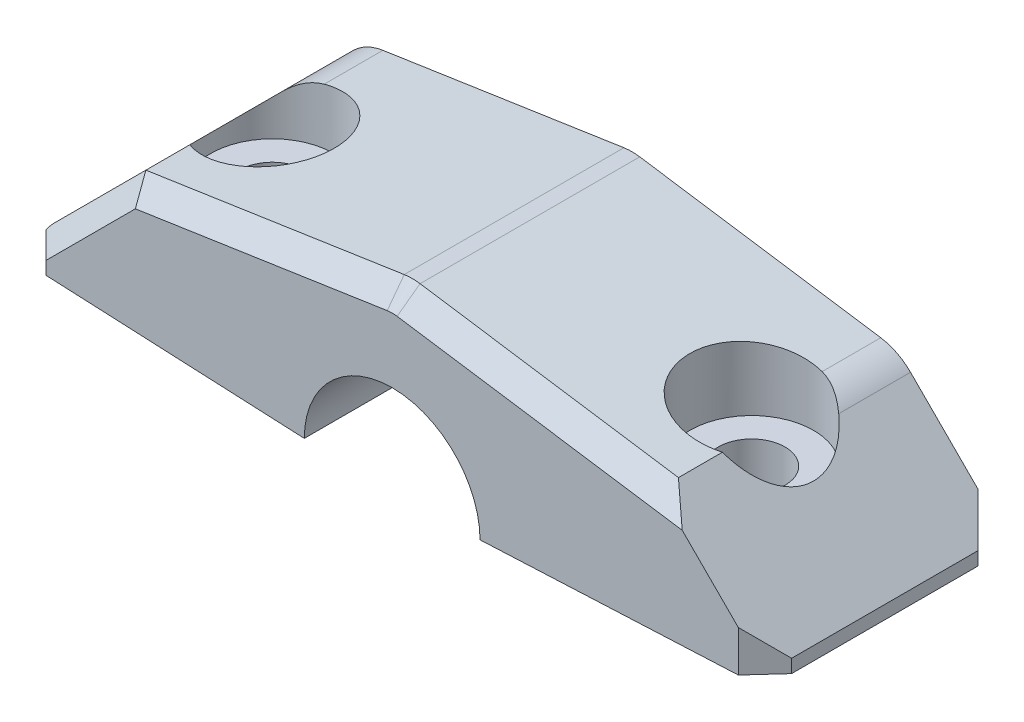
ISO-10303-21;
HEADER;
FILE_DESCRIPTION(('STEP AP214'),'2;1');
FILE_NAME('part.step','',(''),(''),'','','');
FILE_SCHEMA(('AUTOMOTIVE_DESIGN { 1 0 10303 214 1 1 1 1 }'));
ENDSEC;
DATA;
#1=APPLICATION_CONTEXT('core data for automotive mechanical design processes');
#2=APPLICATION_PROTOCOL_DEFINITION('international standard','automotive_design',2000,#1);
#3=PRODUCT_CONTEXT('',#1,'mechanical');
#4=PRODUCT('Part','Part','',(#3));
#5=PRODUCT_RELATED_PRODUCT_CATEGORY('part','',(#4));
#6=PRODUCT_DEFINITION_FORMATION('','',#4);
#7=PRODUCT_DEFINITION_CONTEXT('part definition',#1,'design');
#8=PRODUCT_DEFINITION('design','',#6,#7);
#9=PRODUCT_DEFINITION_SHAPE('','',#8);
#10=(LENGTH_UNIT() NAMED_UNIT(*) SI_UNIT(.MILLI.,.METRE.));
#11=(NAMED_UNIT(*) PLANE_ANGLE_UNIT() SI_UNIT($,.RADIAN.));
#12=(NAMED_UNIT(*) SI_UNIT($,.STERADIAN.) SOLID_ANGLE_UNIT());
#13=UNCERTAINTY_MEASURE_WITH_UNIT(LENGTH_MEASURE(1.E-05),#10,'distance_accuracy_value','');
#14=(GEOMETRIC_REPRESENTATION_CONTEXT(3) GLOBAL_UNCERTAINTY_ASSIGNED_CONTEXT((#13)) GLOBAL_UNIT_ASSIGNED_CONTEXT((#10,
#11,#12)) REPRESENTATION_CONTEXT('',''));
#15=CARTESIAN_POINT('',(0.,0.,0.));
#16=DIRECTION('',(0.,0.,1.));
#17=DIRECTION('',(1.,0.,0.));
#18=AXIS2_PLACEMENT_3D('',#15,#16,#17);
#19=CARTESIAN_POINT('',(9.,6.50025,4.5));
#20=DIRECTION('',(0.,-1.,0.));
#21=DIRECTION('',(0.,0.,-1.));
#22=AXIS2_PLACEMENT_3D('',#19,#20,#21);
#23=CYLINDRICAL_SURFACE('',#22,1.25);
#24=CARTESIAN_POINT('',(9.,0.26635514018692,4.5));
#25=DIRECTION('',(-0.0466780367466305,0.998909986377892,0.));
#26=DIRECTION('',(-0.998909986377892,-0.0466780367466305,0.));
#27=AXIS2_PLACEMENT_3D('',#24,#25,#26);
#28=ELLIPSE('',#27,1.25136400381037,1.25);
#29=CARTESIAN_POINT('',(7.75,0.207943925233648,4.5));
#30=VERTEX_POINT('',#29);
#31=EDGE_CURVE('E509',#30,#30,#28,.F.);
#32=ORIENTED_EDGE('',*,*,#31,.T.);
#33=EDGE_LOOP('',(#32));
#34=FACE_BOUND('',#33,.T.);
#35=CARTESIAN_POINT('',(9.,3.,4.5));
#36=DIRECTION('',(0.,1.,0.));
#37=DIRECTION('',(0.,0.,1.));
#38=AXIS2_PLACEMENT_3D('',#35,#36,#37);
#39=CIRCLE('',#38,1.25);
#40=CARTESIAN_POINT('',(9.,3.,5.75));
#41=VERTEX_POINT('',#40);
#42=EDGE_CURVE('E248',#41,#41,#39,.T.);
#43=ORIENTED_EDGE('',*,*,#42,.T.);
#44=EDGE_LOOP('',(#43));
#45=FACE_BOUND('',#44,.T.);
#46=ADVANCED_FACE('F86',(#34,#45),#23,.F.);
#47=CARTESIAN_POINT('',(-9.,6.50025,4.5));
#48=DIRECTION('',(0.,-1.,0.));
#49=DIRECTION('',(0.,0.,-1.));
#50=AXIS2_PLACEMENT_3D('',#47,#48,#49);
#51=CYLINDRICAL_SURFACE('',#50,1.25);
#52=CARTESIAN_POINT('',(-9.,0.266355140186916,4.5));
#53=DIRECTION('',(0.0466780367466305,0.998909986377892,0.));
#54=DIRECTION('',(0.998909986377892,-0.0466780367466305,0.));
#55=AXIS2_PLACEMENT_3D('',#52,#53,#54);
#56=ELLIPSE('',#55,1.25136400381037,1.25);
#57=CARTESIAN_POINT('',(-7.75,0.207943925233645,4.5));
#58=VERTEX_POINT('',#57);
#59=EDGE_CURVE('E512',#58,#58,#56,.F.);
#60=ORIENTED_EDGE('',*,*,#59,.T.);
#61=EDGE_LOOP('',(#60));
#62=FACE_BOUND('',#61,.T.);
#63=CARTESIAN_POINT('',(-9.,3.,4.5));
#64=DIRECTION('',(0.,1.,0.));
#65=DIRECTION('',(0.,0.,1.));
#66=AXIS2_PLACEMENT_3D('',#63,#64,#65);
#67=CIRCLE('',#66,1.25);
#68=CARTESIAN_POINT('',(-9.,3.,5.75));
#69=VERTEX_POINT('',#68);
#70=EDGE_CURVE('E328',#69,#69,#67,.T.);
#71=ORIENTED_EDGE('',*,*,#70,.T.);
#72=EDGE_LOOP('',(#71));
#73=FACE_BOUND('',#72,.T.);
#74=ADVANCED_FACE('F394',(#62,#73),#51,.F.);
#75=CARTESIAN_POINT('',(0.,0.,9.));
#76=DIRECTION('',(0.,0.,1.));
#77=DIRECTION('',(1.,0.,0.));
#78=AXIS2_PLACEMENT_3D('',#75,#76,#77);
#79=PLANE('',#78);
#80=DIRECTION('',(-0.988936352868298,-0.148340452930245,0.));
#81=VECTOR('',#80,1.);
#82=CARTESIAN_POINT('',(-0.842289892576154,5.61526595050769,9.));
#83=LINE('',#82,#81);
#84=CARTESIAN_POINT('',(-0.185425566162809,5.71379559946969,9.));
#85=VERTEX_POINT('',#84);
#86=CARTESIAN_POINT('',(-9.64438869861889,4.29495112960128,9.));
#87=VERTEX_POINT('',#86);
#88=EDGE_CURVE('E472',#85,#87,#83,.T.);
#89=ORIENTED_EDGE('',*,*,#88,.T.);
#90=DIRECTION('',(-0.707106781186548,-0.707106781186547,0.));
#91=VECTOR('',#90,1.);
#92=CARTESIAN_POINT('',(-6.96966991411008,6.96966991411009,9.));
#93=LINE('',#92,#91);
#94=CARTESIAN_POINT('',(-13.,0.939339828220177,9.));
#95=VERTEX_POINT('',#94);
#96=EDGE_CURVE('E470',#87,#95,#93,.T.);
#97=ORIENTED_EDGE('',*,*,#96,.T.);
#98=DIRECTION('',(0.,-1.,0.));
#99=VECTOR('',#98,1.);
#100=CARTESIAN_POINT('',(-13.,0.500000000000001,9.));
#101=LINE('',#100,#99);
#102=CARTESIAN_POINT('',(-13.,0.453271028037383,9.));
#103=VERTEX_POINT('',#102);
#104=EDGE_CURVE('E324',#95,#103,#101,.T.);
#105=ORIENTED_EDGE('',*,*,#104,.T.);
#106=DIRECTION('',(0.998909986377892,-0.0466780367466305,0.));
#107=VECTOR('',#106,1.);
#108=CARTESIAN_POINT('',(-3.3,0.,9.));
#109=LINE('',#108,#107);
#110=CARTESIAN_POINT('',(-3.3,0.,9.));
#111=VERTEX_POINT('',#110);
#112=EDGE_CURVE('E277',#103,#111,#109,.T.);
#113=ORIENTED_EDGE('',*,*,#112,.T.);
#114=CARTESIAN_POINT('',(0.,0.,9.));
#115=DIRECTION('',(0.,0.,-1.));
#116=DIRECTION('',(1.,0.,0.));
#117=AXIS2_PLACEMENT_3D('',#114,#115,#116);
#118=CIRCLE('',#117,3.3);
#119=CARTESIAN_POINT('',(3.3,0.,9.));
#120=VERTEX_POINT('',#119);
#121=EDGE_CURVE('E270',#111,#120,#118,.T.);
#122=ORIENTED_EDGE('',*,*,#121,.T.);
#123=DIRECTION('',(0.998909986377892,0.0466780367466305,0.));
#124=VECTOR('',#123,1.);
#125=CARTESIAN_POINT('',(3.3,0.,9.));
#126=LINE('',#125,#124);
#127=CARTESIAN_POINT('',(13.,0.453271028037387,9.));
#128=VERTEX_POINT('',#127);
#129=EDGE_CURVE('E273',#120,#128,#126,.T.);
#130=ORIENTED_EDGE('',*,*,#129,.T.);
#131=DIRECTION('',(0.,1.,0.));
#132=VECTOR('',#131,1.);
#133=CARTESIAN_POINT('',(13.,1.,9.));
#134=LINE('',#133,#132);
#135=CARTESIAN_POINT('',(13.,2.00000000000001,9.));
#136=VERTEX_POINT('',#135);
#137=EDGE_CURVE('E237',#128,#136,#134,.T.);
#138=ORIENTED_EDGE('',*,*,#137,.T.);
#139=DIRECTION('',(0.707106781186548,-0.707106781186547,0.));
#140=VECTOR('',#139,1.);
#141=CARTESIAN_POINT('',(7.49999999999999,7.5,9.));
#142=LINE('',#141,#140);
#143=CARTESIAN_POINT('',(10.8922241948305,4.10777580516955,9.));
#144=VERTEX_POINT('',#143);
#145=EDGE_CURVE('E255',#144,#136,#142,.T.);
#146=ORIENTED_EDGE('',*,*,#145,.F.);
#147=DIRECTION('',(-0.988936352868298,0.148340452930244,0.));
#148=VECTOR('',#147,1.);
#149=CARTESIAN_POINT('',(0.1854255661628,5.71379559946969,9.));
#150=LINE('',#149,#148);
#151=CARTESIAN_POINT('',(0.1854255661628,5.71379559946969,9.));
#152=VERTEX_POINT('',#151);
#153=EDGE_CURVE('E381',#144,#152,#150,.T.);
#154=ORIENTED_EDGE('',*,*,#153,.T.);
#155=CARTESIAN_POINT('',(0.,4.47762515838433,9.));
#156=DIRECTION('',(0.,0.,1.));
#157=DIRECTION('',(1.,0.,0.));
#158=AXIS2_PLACEMENT_3D('',#155,#156,#157);
#159=CIRCLE('',#158,1.24999999999999);
#160=EDGE_CURVE('E479',#152,#85,#159,.T.);
#161=ORIENTED_EDGE('',*,*,#160,.T.);
#162=EDGE_LOOP('',(#89,#97,#105,#113,#122,#130,#138,#146,#154,#161));
#163=FACE_BOUND('',#162,.T.);
#164=ADVANCED_FACE('F398',(#163),#79,.T.);
#165=CARTESIAN_POINT('',(0.,0.,0.));
#166=DIRECTION('',(0.,0.,1.));
#167=DIRECTION('',(1.,0.,0.));
#168=AXIS2_PLACEMENT_3D('',#165,#166,#167);
#169=PLANE('',#168);
#170=DIRECTION('',(0.988936352868298,-0.148340452930244,0.));
#171=VECTOR('',#170,1.);
#172=CARTESIAN_POINT('',(0.953545232273837,6.35696821515892,0.));
#173=LINE('',#172,#171);
#174=CARTESIAN_POINT('',(0.296680905860484,6.45549786412093,0.));
#175=VERTEX_POINT('',#174);
#176=CARTESIAN_POINT('',(9.34838410217753,5.09774238467337,0.));
#177=VERTEX_POINT('',#176);
#178=EDGE_CURVE('E257',#175,#177,#173,.T.);
#179=ORIENTED_EDGE('',*,*,#178,.T.);
#180=CARTESIAN_POINT('',(9.05170319631704,3.11986967893678,0.));
#181=DIRECTION('',(0.,0.,1.));
#182=DIRECTION('',(1.,0.,0.));
#183=AXIS2_PLACEMENT_3D('',#180,#181,#182);
#184=CIRCLE('',#183,2.);
#185=CARTESIAN_POINT('',(10.4659167586901,4.53408324130987,0.));
#186=VERTEX_POINT('',#185);
#187=EDGE_CURVE('E518',#177,#186,#184,.F.);
#188=ORIENTED_EDGE('',*,*,#187,.T.);
#189=DIRECTION('',(0.707106781186548,-0.707106781186547,0.));
#190=VECTOR('',#189,1.);
#191=CARTESIAN_POINT('',(7.49999999999999,7.5,0.));
#192=LINE('',#191,#190);
#193=CARTESIAN_POINT('',(13.,2.00000000000001,0.));
#194=VERTEX_POINT('',#193);
#195=EDGE_CURVE('E252',#186,#194,#192,.T.);
#196=ORIENTED_EDGE('',*,*,#195,.T.);
#197=DIRECTION('',(0.,-1.,0.));
#198=VECTOR('',#197,1.);
#199=CARTESIAN_POINT('',(13.,0.,0.));
#200=LINE('',#199,#198);
#201=CARTESIAN_POINT('',(13.,0.453271028037387,0.));
#202=VERTEX_POINT('',#201);
#203=EDGE_CURVE('E302',#194,#202,#200,.T.);
#204=ORIENTED_EDGE('',*,*,#203,.T.);
#205=DIRECTION('',(0.998909986377892,0.0466780367466305,0.));
#206=VECTOR('',#205,1.);
#207=CARTESIAN_POINT('',(3.3,0.,0.));
#208=LINE('',#207,#206);
#209=CARTESIAN_POINT('',(3.3,0.,0.));
#210=VERTEX_POINT('',#209);
#211=EDGE_CURVE('E282',#210,#202,#208,.T.);
#212=ORIENTED_EDGE('',*,*,#211,.F.);
#213=CARTESIAN_POINT('',(0.,0.,0.));
#214=DIRECTION('',(0.,0.,-1.));
#215=DIRECTION('',(1.,0.,0.));
#216=AXIS2_PLACEMENT_3D('',#213,#214,#215);
#217=CIRCLE('',#216,3.3);
#218=CARTESIAN_POINT('',(-3.3,0.,0.));
#219=VERTEX_POINT('',#218);
#220=EDGE_CURVE('E269',#219,#210,#217,.T.);
#221=ORIENTED_EDGE('',*,*,#220,.F.);
#222=DIRECTION('',(0.998909986377892,-0.0466780367466305,0.));
#223=VECTOR('',#222,1.);
#224=CARTESIAN_POINT('',(-3.3,0.,0.));
#225=LINE('',#224,#223);
#226=CARTESIAN_POINT('',(-13.,0.453271028037383,0.));
#227=VERTEX_POINT('',#226);
#228=EDGE_CURVE('E274',#227,#219,#225,.T.);
#229=ORIENTED_EDGE('',*,*,#228,.F.);
#230=DIRECTION('',(0.,1.,0.));
#231=VECTOR('',#230,1.);
#232=CARTESIAN_POINT('',(-13.,0.,0.));
#233=LINE('',#232,#231);
#234=CARTESIAN_POINT('',(-13.,2.,0.));
#235=VERTEX_POINT('',#234);
#236=EDGE_CURVE('E304',#227,#235,#233,.T.);
#237=ORIENTED_EDGE('',*,*,#236,.T.);
#238=DIRECTION('',(-0.707106781186548,-0.707106781186547,0.));
#239=VECTOR('',#238,1.);
#240=CARTESIAN_POINT('',(-7.5,7.5,0.));
#241=LINE('',#240,#239);
#242=CARTESIAN_POINT('',(-10.4659167586901,4.53408324130987,0.));
#243=VERTEX_POINT('',#242);
#244=EDGE_CURVE('E261',#243,#235,#241,.T.);
#245=ORIENTED_EDGE('',*,*,#244,.F.);
#246=CARTESIAN_POINT('',(-9.05170319631704,3.11986967893678,0.));
#247=DIRECTION('',(0.,0.,1.));
#248=DIRECTION('',(1.,0.,0.));
#249=AXIS2_PLACEMENT_3D('',#246,#247,#248);
#250=CIRCLE('',#249,2.);
#251=CARTESIAN_POINT('',(-9.34838410217752,5.09774238467337,0.));
#252=VERTEX_POINT('',#251);
#253=EDGE_CURVE('E524',#243,#252,#250,.F.);
#254=ORIENTED_EDGE('',*,*,#253,.T.);
#255=DIRECTION('',(-0.988936352868298,-0.148340452930245,0.));
#256=VECTOR('',#255,1.);
#257=CARTESIAN_POINT('',(-0.953545232273839,6.35696821515892,0.));
#258=LINE('',#257,#256);
#259=CARTESIAN_POINT('',(-0.296680905860494,6.45549786412093,0.));
#260=VERTEX_POINT('',#259);
#261=EDGE_CURVE('E263',#260,#252,#258,.T.);
#262=ORIENTED_EDGE('',*,*,#261,.F.);
#263=CARTESIAN_POINT('',(0.,4.47762515838433,0.));
#264=DIRECTION('',(0.,0.,1.));
#265=DIRECTION('',(1.,0.,0.));
#266=AXIS2_PLACEMENT_3D('',#263,#264,#265);
#267=CIRCLE('',#266,2.);
#268=EDGE_CURVE('E521',#260,#175,#267,.F.);
#269=ORIENTED_EDGE('',*,*,#268,.T.);
#270=EDGE_LOOP('',(#179,#188,#196,#204,#212,#221,#229,#237,#245,#254,#262,#269));
#271=FACE_BOUND('',#270,.T.);
#272=ADVANCED_FACE('F416',(#271),#169,.F.);
#273=CARTESIAN_POINT('',(0.,0.,9.));
#274=DIRECTION('',(0.,0.,-1.));
#275=DIRECTION('',(-1.,0.,0.));
#276=AXIS2_PLACEMENT_3D('',#273,#274,#275);
#277=CYLINDRICAL_SURFACE('',#276,3.3);
#278=ORIENTED_EDGE('',*,*,#220,.T.);
#279=DIRECTION('',(0.,0.,-1.));
#280=VECTOR('',#279,1.);
#281=CARTESIAN_POINT('',(3.3,0.,9.));
#282=LINE('',#281,#280);
#283=EDGE_CURVE('E294',#120,#210,#282,.T.);
#284=ORIENTED_EDGE('',*,*,#283,.F.);
#285=ORIENTED_EDGE('',*,*,#121,.F.);
#286=DIRECTION('',(0.,0.,-1.));
#287=VECTOR('',#286,1.);
#288=CARTESIAN_POINT('',(-3.3,0.,9.));
#289=LINE('',#288,#287);
#290=EDGE_CURVE('E279',#111,#219,#289,.T.);
#291=ORIENTED_EDGE('',*,*,#290,.T.);
#292=EDGE_LOOP('',(#278,#284,#285,#291));
#293=FACE_BOUND('',#292,.T.);
#294=ADVANCED_FACE('F420',(#293),#277,.F.);
#295=CARTESIAN_POINT('',(3.3,0.,9.));
#296=DIRECTION('',(-0.0466780367466305,0.998909986377892,0.));
#297=DIRECTION('',(-0.998909986377892,-0.0466780367466305,0.));
#298=AXIS2_PLACEMENT_3D('',#295,#296,#297);
#299=PLANE('',#298);
#300=ORIENTED_EDGE('',*,*,#31,.F.);
#301=EDGE_LOOP('',(#300));
#302=FACE_BOUND('',#301,.T.);
#303=ORIENTED_EDGE('',*,*,#211,.T.);
#304=DIRECTION('',(-0.706721087952453,-0.0330243499043203,-0.706721087952453));
#305=VECTOR('',#304,1.);
#306=CARTESIAN_POINT('',(14.,0.500000000000004,1.));
#307=LINE('',#306,#305);
#308=CARTESIAN_POINT('',(14.,0.500000000000004,1.));
#309=VERTEX_POINT('',#308);
#310=EDGE_CURVE('E322',#202,#309,#307,.F.);
#311=ORIENTED_EDGE('',*,*,#310,.T.);
#312=DIRECTION('',(0.,0.,-1.));
#313=VECTOR('',#312,1.);
#314=CARTESIAN_POINT('',(14.,0.500000000000004,9.));
#315=LINE('',#314,#313);
#316=CARTESIAN_POINT('',(14.,0.500000000000004,7.99999999999999));
#317=VERTEX_POINT('',#316);
#318=EDGE_CURVE('E291',#317,#309,#315,.T.);
#319=ORIENTED_EDGE('',*,*,#318,.F.);
#320=DIRECTION('',(-0.706721087952451,-0.0330243499043202,0.706721087952454));
#321=VECTOR('',#320,1.);
#322=CARTESIAN_POINT('',(12.98942110544,0.452776687170095,9.01057889456005));
#323=LINE('',#322,#321);
#324=EDGE_CURVE('E320',#317,#128,#323,.T.);
#325=ORIENTED_EDGE('',*,*,#324,.T.);
#326=ORIENTED_EDGE('',*,*,#129,.F.);
#327=ORIENTED_EDGE('',*,*,#283,.T.);
#328=EDGE_LOOP('',(#303,#311,#319,#325,#326,#327));
#329=FACE_BOUND('',#328,.T.);
#330=ADVANCED_FACE('F428',(#302,#329),#299,.F.);
#331=CARTESIAN_POINT('',(14.,0.500000000000004,9.));
#332=DIRECTION('',(-1.,0.,0.));
#333=DIRECTION('',(0.,-1.,0.));
#334=AXIS2_PLACEMENT_3D('',#331,#332,#333);
#335=PLANE('',#334);
#336=ORIENTED_EDGE('',*,*,#318,.T.);
#337=DIRECTION('',(0.,1.,0.));
#338=VECTOR('',#337,1.);
#339=CARTESIAN_POINT('',(14.,0.500000000000004,1.));
#340=LINE('',#339,#338);
#341=CARTESIAN_POINT('',(14.,1.,1.));
#342=VERTEX_POINT('',#341);
#343=EDGE_CURVE('E312',#309,#342,#340,.T.);
#344=ORIENTED_EDGE('',*,*,#343,.T.);
#345=DIRECTION('',(0.,0.,1.));
#346=VECTOR('',#345,1.);
#347=CARTESIAN_POINT('',(14.,1.,0.));
#348=LINE('',#347,#346);
#349=CARTESIAN_POINT('',(14.,1.,7.99999999999999));
#350=VERTEX_POINT('',#349);
#351=EDGE_CURVE('E251',#342,#350,#348,.T.);
#352=ORIENTED_EDGE('',*,*,#351,.T.);
#353=DIRECTION('',(0.,-1.,0.));
#354=VECTOR('',#353,1.);
#355=CARTESIAN_POINT('',(14.,0.500000000000004,7.99999999999999));
#356=LINE('',#355,#354);
#357=EDGE_CURVE('E310',#350,#317,#356,.T.);
#358=ORIENTED_EDGE('',*,*,#357,.T.);
#359=EDGE_LOOP('',(#336,#344,#352,#358));
#360=FACE_BOUND('',#359,.T.);
#361=ADVANCED_FACE('F424',(#360),#335,.F.);
#362=CARTESIAN_POINT('',(-3.3,0.,9.));
#363=DIRECTION('',(0.0466780367466305,0.998909986377892,0.));
#364=DIRECTION('',(-0.998909986377892,0.0466780367466305,0.));
#365=AXIS2_PLACEMENT_3D('',#362,#363,#364);
#366=PLANE('',#365);
#367=ORIENTED_EDGE('',*,*,#59,.F.);
#368=EDGE_LOOP('',(#367));
#369=FACE_BOUND('',#368,.T.);
#370=DIRECTION('',(0.,0.,-1.));
#371=VECTOR('',#370,1.);
#372=CARTESIAN_POINT('',(-14.,0.5,9.));
#373=LINE('',#372,#371);
#374=CARTESIAN_POINT('',(-14.,0.5,7.99999999999999));
#375=VERTEX_POINT('',#374);
#376=CARTESIAN_POINT('',(-14.,0.5,1.));
#377=VERTEX_POINT('',#376);
#378=EDGE_CURVE('E288',#375,#377,#373,.T.);
#379=ORIENTED_EDGE('',*,*,#378,.T.);
#380=DIRECTION('',(-0.706721087952453,0.0330243499043203,0.706721087952453));
#381=VECTOR('',#380,1.);
#382=CARTESIAN_POINT('',(-14.,0.5,1.));
#383=LINE('',#382,#381);
#384=EDGE_CURVE('E300',#377,#227,#383,.F.);
#385=ORIENTED_EDGE('',*,*,#384,.T.);
#386=ORIENTED_EDGE('',*,*,#228,.T.);
#387=ORIENTED_EDGE('',*,*,#290,.F.);
#388=ORIENTED_EDGE('',*,*,#112,.F.);
#389=DIRECTION('',(-0.706721087952451,0.0330243499043202,-0.706721087952454));
#390=VECTOR('',#389,1.);
#391=CARTESIAN_POINT('',(-12.98942110544,0.452776687170091,9.01057889456005));
#392=LINE('',#391,#390);
#393=EDGE_CURVE('E297',#103,#375,#392,.T.);
#394=ORIENTED_EDGE('',*,*,#393,.T.);
#395=EDGE_LOOP('',(#379,#385,#386,#387,#388,#394));
#396=FACE_BOUND('',#395,.T.);
#397=ADVANCED_FACE('F412',(#369,#396),#366,.F.);
#398=CARTESIAN_POINT('',(-7.5,7.5,0.));
#399=DIRECTION('',(-0.707106781186547,0.707106781186548,0.));
#400=DIRECTION('',(-0.707106781186548,-0.707106781186547,0.));
#401=AXIS2_PLACEMENT_3D('',#398,#399,#400);
#402=PLANE('',#401);
#403=DIRECTION('',(0.,0.,-1.));
#404=VECTOR('',#403,1.);
#405=CARTESIAN_POINT('',(-13.4471259244523,1.55287407554769,7.99999999999999));
#406=LINE('',#405,#404);
#407=CARTESIAN_POINT('',(-13.4471259244523,1.55287407554769,0.447125924452317));
#408=VERTEX_POINT('',#407);
#409=CARTESIAN_POINT('',(-13.4471259244523,1.55287407554769,8.24999999999999));
#410=VERTEX_POINT('',#409);
#411=EDGE_CURVE('E337',#408,#410,#406,.F.);
#412=ORIENTED_EDGE('',*,*,#411,.T.);
#413=DIRECTION('',(0.707106781186548,0.707106781186547,0.));
#414=VECTOR('',#413,1.);
#415=CARTESIAN_POINT('',(-7.5,7.5,8.24999999999999));
#416=LINE('',#415,#414);
#417=CARTESIAN_POINT('',(-10.,5.,8.24999999999999));
#418=VERTEX_POINT('',#417);
#419=EDGE_CURVE('E483',#410,#418,#416,.T.);
#420=ORIENTED_EDGE('',*,*,#419,.T.);
#421=DIRECTION('',(0.,0.,1.));
#422=VECTOR('',#421,1.);
#423=CARTESIAN_POINT('',(-10.,5.,0.));
#424=LINE('',#423,#422);
#425=CARTESIAN_POINT('',(-10.,5.,6.59895807485524));
#426=VERTEX_POINT('',#425);
#427=EDGE_CURVE('E266',#426,#418,#424,.T.);
#428=ORIENTED_EDGE('',*,*,#427,.F.);
#429=CARTESIAN_POINT('',(-9.,6.,4.5));
#430=DIRECTION('',(-0.707106781186547,0.707106781186548,0.));
#431=DIRECTION('',(-0.707106781186548,-0.707106781186547,0.));
#432=AXIS2_PLACEMENT_3D('',#429,#430,#431);
#433=ELLIPSE('',#432,3.28804653251745,2.325);
#434=CARTESIAN_POINT('',(-10.4659167586901,4.53408324130987,2.69536345581959));
#435=VERTEX_POINT('',#434);
#436=EDGE_CURVE('E247',#426,#435,#433,.F.);
#437=ORIENTED_EDGE('',*,*,#436,.T.);
#438=DIRECTION('',(0.,0.,1.));
#439=VECTOR('',#438,1.);
#440=CARTESIAN_POINT('',(-10.4659167586901,4.53408324130987,0.));
#441=LINE('',#440,#439);
#442=EDGE_CURVE('E335',#435,#243,#441,.F.);
#443=ORIENTED_EDGE('',*,*,#442,.T.);
#444=ORIENTED_EDGE('',*,*,#244,.T.);
#445=DIRECTION('',(0.577350269189626,0.577350269189625,-0.577350269189626));
#446=VECTOR('',#445,1.);
#447=CARTESIAN_POINT('',(-9.33333333333333,5.66666666666667,-3.66666666666667));
#448=LINE('',#447,#446);
#449=EDGE_CURVE('E307',#235,#408,#448,.F.);
#450=ORIENTED_EDGE('',*,*,#449,.T.);
#451=EDGE_LOOP('',(#412,#420,#428,#437,#443,#444,#450));
#452=FACE_BOUND('',#451,.T.);
#453=ADVANCED_FACE('F408',(#452),#402,.T.);
#454=CARTESIAN_POINT('',(-0.953545232273839,6.35696821515892,0.));
#455=DIRECTION('',(-0.148340452930245,0.988936352868297,0.));
#456=DIRECTION('',(-0.988936352868298,-0.148340452930245,0.));
#457=AXIS2_PLACEMENT_3D('',#454,#455,#456);
#458=PLANE('',#457);
#459=ORIENTED_EDGE('',*,*,#427,.T.);
#460=DIRECTION('',(0.988936352868298,0.148340452930245,0.));
#461=VECTOR('',#460,1.);
#462=CARTESIAN_POINT('',(-0.953545232273839,6.35696821515892,8.24999999999999));
#463=LINE('',#462,#461);
#464=CARTESIAN_POINT('',(-0.296680905860493,6.45549786412093,8.24999999999999));
#465=VERTEX_POINT('',#464);
#466=EDGE_CURVE('E485',#418,#465,#463,.T.);
#467=ORIENTED_EDGE('',*,*,#466,.T.);
#468=DIRECTION('',(0.,0.,1.));
#469=VECTOR('',#468,1.);
#470=CARTESIAN_POINT('',(-0.296680905860493,6.45549786412093,0.));
#471=LINE('',#470,#469);
#472=EDGE_CURVE('E523',#465,#260,#471,.F.);
#473=ORIENTED_EDGE('',*,*,#472,.T.);
#474=ORIENTED_EDGE('',*,*,#261,.T.);
#475=DIRECTION('',(0.,0.,1.));
#476=VECTOR('',#475,1.);
#477=CARTESIAN_POINT('',(-9.34838410217752,5.09774238467337,0.));
#478=LINE('',#477,#476);
#479=CARTESIAN_POINT('',(-9.34838410217752,5.09774238467337,2.20124957480157));
#480=VERTEX_POINT('',#479);
#481=EDGE_CURVE('E382',#252,#480,#478,.T.);
#482=ORIENTED_EDGE('',*,*,#481,.T.);
#483=CARTESIAN_POINT('',(-9.,5.15,4.5));
#484=DIRECTION('',(-0.148340452930245,0.988936352868297,0.));
#485=DIRECTION('',(-0.988936352868298,-0.148340452930245,0.));
#486=AXIS2_PLACEMENT_3D('',#483,#484,#485);
#487=ELLIPSE('',#486,2.35101075337822,2.325);
#488=EDGE_CURVE('E236',#480,#426,#487,.F.);
#489=ORIENTED_EDGE('',*,*,#488,.T.);
#490=EDGE_LOOP('',(#459,#467,#473,#474,#482,#489));
#491=FACE_BOUND('',#490,.T.);
#492=ADVANCED_FACE('F402',(#491),#458,.T.);
#493=CARTESIAN_POINT('',(7.49999999999999,7.5,0.));
#494=DIRECTION('',(-0.707106781186547,-0.707106781186548,0.));
#495=DIRECTION('',(0.707106781186548,-0.707106781186547,0.));
#496=AXIS2_PLACEMENT_3D('',#493,#494,#495);
#497=PLANE('',#496);
#498=DIRECTION('',(0.,0.,1.));
#499=VECTOR('',#498,1.);
#500=CARTESIAN_POINT('',(10.,5.,0.));
#501=LINE('',#500,#499);
#502=CARTESIAN_POINT('',(10.,5.,6.59895807485523));
#503=VERTEX_POINT('',#502);
#504=CARTESIAN_POINT('',(10.,5.,8.24999999999999));
#505=VERTEX_POINT('',#504);
#506=EDGE_CURVE('E242',#503,#505,#501,.T.);
#507=ORIENTED_EDGE('',*,*,#506,.T.);
#508=DIRECTION('',(0.607837994866737,-0.607837994866736,0.510946126311542));
#509=VECTOR('',#508,1.);
#510=CARTESIAN_POINT('',(6.15627822944894,8.84372177055105,5.01898323917217));
#511=LINE('',#510,#509);
#512=EDGE_CURVE('E12',#505,#144,#511,.T.);
#513=ORIENTED_EDGE('',*,*,#512,.T.);
#514=ORIENTED_EDGE('',*,*,#145,.T.);
#515=DIRECTION('',(0.577350269189625,-0.577350269189624,-0.577350269189628));
#516=VECTOR('',#515,1.);
#517=CARTESIAN_POINT('',(13.6666666666667,1.33333333333334,8.33333333333333));
#518=LINE('',#517,#516);
#519=EDGE_CURVE('E315',#136,#350,#518,.T.);
#520=ORIENTED_EDGE('',*,*,#519,.T.);
#521=ORIENTED_EDGE('',*,*,#351,.F.);
#522=DIRECTION('',(0.577350269189626,-0.577350269189625,0.577350269189626));
#523=VECTOR('',#522,1.);
#524=CARTESIAN_POINT('',(14.1666666666667,0.83333333333334,1.16666666666667));
#525=LINE('',#524,#523);
#526=EDGE_CURVE('E317',#342,#194,#525,.F.);
#527=ORIENTED_EDGE('',*,*,#526,.T.);
#528=ORIENTED_EDGE('',*,*,#195,.F.);
#529=DIRECTION('',(0.,0.,1.));
#530=VECTOR('',#529,1.);
#531=CARTESIAN_POINT('',(10.4659167586901,4.53408324130987,0.));
#532=LINE('',#531,#530);
#533=CARTESIAN_POINT('',(10.4659167586901,4.53408324130987,2.69536345581959));
#534=VERTEX_POINT('',#533);
#535=EDGE_CURVE('E246',#186,#534,#532,.T.);
#536=ORIENTED_EDGE('',*,*,#535,.T.);
#537=CARTESIAN_POINT('',(9.,6.,4.5));
#538=DIRECTION('',(-0.707106781186547,-0.707106781186548,0.));
#539=DIRECTION('',(0.707106781186548,-0.707106781186547,0.));
#540=AXIS2_PLACEMENT_3D('',#537,#538,#539);
#541=ELLIPSE('',#540,3.28804653251744,2.325);
#542=EDGE_CURVE('E233',#503,#534,#541,.F.);
#543=ORIENTED_EDGE('',*,*,#542,.F.);
#544=EDGE_LOOP('',(#507,#513,#514,#520,#521,#527,#528,#536,#543));
#545=FACE_BOUND('',#544,.T.);
#546=ADVANCED_FACE('F241',(#545),#497,.F.);
#547=CARTESIAN_POINT('',(0.953545232273837,6.35696821515892,0.));
#548=DIRECTION('',(-0.148340452930244,-0.988936352868298,0.));
#549=DIRECTION('',(0.988936352868298,-0.148340452930244,0.));
#550=AXIS2_PLACEMENT_3D('',#547,#548,#549);
#551=PLANE('',#550);
#552=DIRECTION('',(0.,0.,1.));
#553=VECTOR('',#552,1.);
#554=CARTESIAN_POINT('',(0.296680905860485,6.45549786412093,9.));
#555=LINE('',#554,#553);
#556=CARTESIAN_POINT('',(0.296680905860485,6.45549786412093,8.24999999999999));
#557=VERTEX_POINT('',#556);
#558=EDGE_CURVE('E352',#175,#557,#555,.T.);
#559=ORIENTED_EDGE('',*,*,#558,.T.);
#560=DIRECTION('',(0.988936352868298,-0.148340452930244,0.));
#561=VECTOR('',#560,1.);
#562=CARTESIAN_POINT('',(10.,5.,8.24999999999999));
#563=LINE('',#562,#561);
#564=EDGE_CURVE('E96',#557,#505,#563,.T.);
#565=ORIENTED_EDGE('',*,*,#564,.T.);
#566=ORIENTED_EDGE('',*,*,#506,.F.);
#567=CARTESIAN_POINT('',(9.,5.15,4.5));
#568=DIRECTION('',(-0.148340452930244,-0.988936352868298,0.));
#569=DIRECTION('',(0.988936352868298,-0.148340452930244,0.));
#570=AXIS2_PLACEMENT_3D('',#567,#568,#569);
#571=ELLIPSE('',#570,2.35101075337821,2.325);
#572=CARTESIAN_POINT('',(9.34838410217752,5.09774238467337,2.20124957480157));
#573=VERTEX_POINT('',#572);
#574=EDGE_CURVE('E230',#573,#503,#571,.F.);
#575=ORIENTED_EDGE('',*,*,#574,.F.);
#576=DIRECTION('',(0.,0.,1.));
#577=VECTOR('',#576,1.);
#578=CARTESIAN_POINT('',(9.34838410217752,5.09774238467337,0.));
#579=LINE('',#578,#577);
#580=EDGE_CURVE('E522',#573,#177,#579,.F.);
#581=ORIENTED_EDGE('',*,*,#580,.T.);
#582=ORIENTED_EDGE('',*,*,#178,.F.);
#583=EDGE_LOOP('',(#559,#565,#566,#575,#581,#582));
#584=FACE_BOUND('',#583,.T.);
#585=ADVANCED_FACE('F250',(#584),#551,.F.);
#586=CARTESIAN_POINT('',(-14.,0.5,1.));
#587=DIRECTION('',(0.707106781186548,0.,0.707106781186547));
#588=DIRECTION('',(0.,-1.,0.));
#589=AXIS2_PLACEMENT_3D('',#586,#587,#588);
#590=PLANE('',#589);
#591=ORIENTED_EDGE('',*,*,#384,.F.);
#592=CARTESIAN_POINT('',(-12.0329123620792,0.138660513174591,-0.967087637920777));
#593=DIRECTION('',(0.707106781186548,0.,0.707106781186547));
#594=DIRECTION('',(-0.707106781186547,0.,0.707106781186548));
#595=AXIS2_PLACEMENT_3D('',#592,#593,#594);
#596=ELLIPSE('',#595,2.82842712474619,2.);
#597=EDGE_CURVE('E342',#377,#408,#596,.F.);
#598=ORIENTED_EDGE('',*,*,#597,.T.);
#599=ORIENTED_EDGE('',*,*,#449,.F.);
#600=ORIENTED_EDGE('',*,*,#236,.F.);
#601=EDGE_LOOP('',(#591,#598,#599,#600));
#602=FACE_BOUND('',#601,.T.);
#603=ADVANCED_FACE('F405',(#602),#590,.F.);
#604=CARTESIAN_POINT('',(14.,0.500000000000004,1.));
#605=DIRECTION('',(-0.707106781186548,0.,0.707106781186547));
#606=DIRECTION('',(0.,1.,0.));
#607=AXIS2_PLACEMENT_3D('',#604,#605,#606);
#608=PLANE('',#607);
#609=ORIENTED_EDGE('',*,*,#310,.F.);
#610=ORIENTED_EDGE('',*,*,#203,.F.);
#611=ORIENTED_EDGE('',*,*,#526,.F.);
#612=ORIENTED_EDGE('',*,*,#343,.F.);
#613=EDGE_LOOP('',(#609,#610,#611,#612));
#614=FACE_BOUND('',#613,.T.);
#615=ADVANCED_FACE('F442',(#614),#608,.F.);
#616=CARTESIAN_POINT('',(13.,0.,9.));
#617=DIRECTION('',(0.707106781186549,0.,0.707106781186546));
#618=DIRECTION('',(0.,-1.,0.));
#619=AXIS2_PLACEMENT_3D('',#616,#617,#618);
#620=PLANE('',#619);
#621=ORIENTED_EDGE('',*,*,#324,.F.);
#622=ORIENTED_EDGE('',*,*,#357,.F.);
#623=ORIENTED_EDGE('',*,*,#519,.F.);
#624=ORIENTED_EDGE('',*,*,#137,.F.);
#625=EDGE_LOOP('',(#621,#622,#623,#624));
#626=FACE_BOUND('',#625,.T.);
#627=ADVANCED_FACE('F449',(#626),#620,.T.);
#628=CARTESIAN_POINT('',(-13.,0.,9.));
#629=DIRECTION('',(-0.707106781186549,0.,0.707106781186546));
#630=DIRECTION('',(0.,1.,0.));
#631=AXIS2_PLACEMENT_3D('',#628,#629,#630);
#632=PLANE('',#631);
#633=ORIENTED_EDGE('',*,*,#104,.F.);
#634=DIRECTION('',(0.678598344545846,-0.281084637714821,0.678598344545848));
#635=VECTOR('',#634,1.);
#636=CARTESIAN_POINT('',(-12.8208269678813,0.865123928305089,9.17917303211873));
#637=LINE('',#636,#635);
#638=CARTESIAN_POINT('',(-13.707382281723,1.23234716309227,8.292617718277));
#639=VERTEX_POINT('',#638);
#640=EDGE_CURVE('E464',#95,#639,#637,.F.);
#641=ORIENTED_EDGE('',*,*,#640,.T.);
#642=CARTESIAN_POINT('',(-12.0329123620792,0.138660513174591,9.96708763792078));
#643=DIRECTION('',(-0.707106781186549,0.,0.707106781186546));
#644=DIRECTION('',(0.707106781186546,0.,0.707106781186549));
#645=AXIS2_PLACEMENT_3D('',#642,#643,#644);
#646=ELLIPSE('',#645,2.8284271247462,2.);
#647=EDGE_CURVE('E340',#639,#375,#646,.T.);
#648=ORIENTED_EDGE('',*,*,#647,.T.);
#649=ORIENTED_EDGE('',*,*,#393,.F.);
#650=EDGE_LOOP('',(#633,#641,#648,#649));
#651=FACE_BOUND('',#650,.T.);
#652=ADVANCED_FACE('F390',(#651),#632,.T.);
#653=CARTESIAN_POINT('',(-9.,13.,4.5));
#654=DIRECTION('',(0.,-1.,0.));
#655=DIRECTION('',(0.,0.,-1.));
#656=AXIS2_PLACEMENT_3D('',#653,#654,#655);
#657=CYLINDRICAL_SURFACE('',#656,2.325);
#658=ORIENTED_EDGE('',*,*,#488,.F.);
#659=CARTESIAN_POINT('',(-9.34838410217752,5.09774238467337,2.20124957480157));
#660=CARTESIAN_POINT('',(-9.39945596382386,5.09009205504691,2.20897808358826));
#661=CARTESIAN_POINT('',(-9.44995389868438,5.0804850305587,2.21838325994173));
#662=CARTESIAN_POINT('',(-9.54936945098298,5.05762999421011,2.2402675038835));
#663=CARTESIAN_POINT('',(-9.59828902138237,5.04438669112899,2.25274259395048));
#664=CARTESIAN_POINT('',(-9.69389405996979,5.01462093066307,2.28040583492465));
#665=CARTESIAN_POINT('',(-9.74059337587652,4.99812345087325,2.29557323717744));
#666=CARTESIAN_POINT('',(-9.83189604400059,4.96207220431903,2.32838094203447));
#667=CARTESIAN_POINT('',(-9.87649878166026,4.94251754859967,2.34602196375482));
#668=CARTESIAN_POINT('',(-10.0063967869481,4.87991401834362,2.40199257362426));
#669=CARTESIAN_POINT('',(-10.0883617147874,4.8327396953172,2.44354352301061));
#670=CARTESIAN_POINT('',(-10.242583357946,4.72935898723977,2.53287659076254));
#671=CARTESIAN_POINT('',(-10.3148311700806,4.67314442131857,2.58066434560567));
#672=CARTESIAN_POINT('',(-10.4109802919683,4.58746854094996,2.65174502510853));
#673=CARTESIAN_POINT('',(-10.4389002222673,4.56109386313324,2.67341602225638));
#674=CARTESIAN_POINT('',(-10.4659167586901,4.53408324130988,2.69536345581959));
#675=B_SPLINE_CURVE_WITH_KNOTS('',3,(#659,#660,#661,#662,#663,#664,#665,#666,#667,#668,#669,
#670,#671,#672,#673,#674),.UNSPECIFIED.,.F.,.F.,(4,2,2,2,2,2,2,4),(0.,0.156545505191639,
0.312889240981931,0.468076633746135,0.6233092355757,0.931898115960421,1.24076783840068,
1.37298883792695),.UNSPECIFIED.);
#676=EDGE_CURVE('E373',#480,#435,#675,.T.);
#677=ORIENTED_EDGE('',*,*,#676,.T.);
#678=ORIENTED_EDGE('',*,*,#436,.F.);
#679=EDGE_LOOP('',(#658,#677,#678));
#680=FACE_BOUND('',#679,.T.);
#681=CARTESIAN_POINT('',(-9.,3.,4.5));
#682=DIRECTION('',(0.,1.,0.));
#683=DIRECTION('',(0.,0.,1.));
#684=AXIS2_PLACEMENT_3D('',#681,#682,#683);
#685=CIRCLE('',#684,2.325);
#686=CARTESIAN_POINT('',(-9.,3.,6.825));
#687=VERTEX_POINT('',#686);
#688=EDGE_CURVE('E496',#687,#687,#685,.T.);
#689=ORIENTED_EDGE('',*,*,#688,.F.);
#690=EDGE_LOOP('',(#689));
#691=FACE_BOUND('',#690,.T.);
#692=ADVANCED_FACE('F385',(#680,#691),#657,.F.);
#693=CARTESIAN_POINT('',(-9.,3.,4.5));
#694=DIRECTION('',(0.,1.,0.));
#695=DIRECTION('',(0.,0.,1.));
#696=AXIS2_PLACEMENT_3D('',#693,#694,#695);
#697=PLANE('',#696);
#698=ORIENTED_EDGE('',*,*,#70,.F.);
#699=EDGE_LOOP('',(#698));
#700=FACE_BOUND('',#699,.T.);
#701=ORIENTED_EDGE('',*,*,#688,.T.);
#702=EDGE_LOOP('',(#701));
#703=FACE_BOUND('',#702,.T.);
#704=ADVANCED_FACE('F389',(#700,#703),#697,.T.);
#705=CARTESIAN_POINT('',(9.,13.,4.5));
#706=DIRECTION('',(0.,-1.,0.));
#707=DIRECTION('',(0.,0.,-1.));
#708=AXIS2_PLACEMENT_3D('',#705,#706,#707);
#709=CYLINDRICAL_SURFACE('',#708,2.325);
#710=CARTESIAN_POINT('',(9.,3.,4.5));
#711=DIRECTION('',(0.,1.,0.));
#712=DIRECTION('',(0.,0.,1.));
#713=AXIS2_PLACEMENT_3D('',#710,#711,#712);
#714=CIRCLE('',#713,2.325);
#715=CARTESIAN_POINT('',(9.,3.,6.825));
#716=VERTEX_POINT('',#715);
#717=EDGE_CURVE('E331',#716,#716,#714,.T.);
#718=ORIENTED_EDGE('',*,*,#717,.F.);
#719=EDGE_LOOP('',(#718));
#720=FACE_BOUND('',#719,.T.);
#721=ORIENTED_EDGE('',*,*,#542,.T.);
#722=CARTESIAN_POINT('',(10.4659167586901,4.53408324130987,2.69536345581959));
#723=CARTESIAN_POINT('',(10.4293464902775,4.57063559318703,2.66566365955529));
#724=CARTESIAN_POINT('',(10.3911761556992,4.60598498221824,2.6364987769572));
#725=CARTESIAN_POINT('',(10.3115155977848,4.6741023252663,2.57959354534153));
#726=CARTESIAN_POINT('',(10.2700216785466,4.7068673227468,2.55185484013857));
#727=CARTESIAN_POINT('',(10.1432627043792,4.79889862009906,2.47312434097081));
#728=CARTESIAN_POINT('',(10.0533836863994,4.85426160587494,2.42467209971715));
#729=CARTESIAN_POINT('',(9.91239735379945,4.92591717952369,2.36092278376217));
#730=CARTESIAN_POINT('',(9.86569468604243,4.94746679732778,2.34156971764398));
#731=CARTESIAN_POINT('',(9.76987070403171,4.98720000347492,2.30556618416612));
#732=CARTESIAN_POINT('',(9.72075013182349,5.00538461647121,2.288914894299));
#733=CARTESIAN_POINT('',(9.61887565739634,5.03853189246006,2.25823154294584));
#734=CARTESIAN_POINT('',(9.56605717733669,5.05338284287602,2.24429194386901));
#735=CARTESIAN_POINT('',(9.4585164810372,5.0788429859883,2.21998883085944));
#736=CARTESIAN_POINT('',(9.40379130273445,5.0894452268806,2.2096311815309));
#737=CARTESIAN_POINT('',(9.34838410217752,5.09774238467337,2.20124957480157));
#738=B_SPLINE_CURVE_WITH_KNOTS('',3,(#722,#723,#724,#725,#726,#727,#728,#729,#730,#731,#732,
#733,#734,#735,#736,#737),.UNSPECIFIED.,.F.,.F.,(4,2,2,2,2,2,2,4),(0.,0.178791482819431,
0.357784622253449,0.704332037853002,0.869023822442732,1.03366537511014,1.20319602398823,
1.37300293991336),.UNSPECIFIED.);
#739=EDGE_CURVE('E234',#534,#573,#738,.T.);
#740=ORIENTED_EDGE('',*,*,#739,.T.);
#741=ORIENTED_EDGE('',*,*,#574,.T.);
#742=EDGE_LOOP('',(#721,#740,#741));
#743=FACE_BOUND('',#742,.T.);
#744=ADVANCED_FACE('F232',(#720,#743),#709,.F.);
#745=CARTESIAN_POINT('',(9.,3.,4.5));
#746=DIRECTION('',(0.,1.,0.));
#747=DIRECTION('',(0.,0.,1.));
#748=AXIS2_PLACEMENT_3D('',#745,#746,#747);
#749=PLANE('',#748);
#750=ORIENTED_EDGE('',*,*,#42,.F.);
#751=EDGE_LOOP('',(#750));
#752=FACE_BOUND('',#751,.T.);
#753=ORIENTED_EDGE('',*,*,#717,.T.);
#754=EDGE_LOOP('',(#753));
#755=FACE_BOUND('',#754,.T.);
#756=ADVANCED_FACE('F607',(#752,#755),#749,.T.);
#757=CARTESIAN_POINT('',(-12.0329123620792,0.138660513174591,9.));
#758=DIRECTION('',(0.,0.,1.));
#759=DIRECTION('',(1.,0.,0.));
#760=AXIS2_PLACEMENT_3D('',#757,#758,#759);
#761=CYLINDRICAL_SURFACE('',#760,2.);
#762=ORIENTED_EDGE('',*,*,#647,.F.);
#763=CARTESIAN_POINT('',(-12.0329123620792,0.138660513174591,10.25));
#764=DIRECTION('',(0.500000000000001,-0.500000000000001,-0.707106781186547));
#765=DIRECTION('',(0.499999999999999,-0.499999999999999,0.707106781186548));
#766=AXIS2_PLACEMENT_3D('',#763,#764,#765);
#767=ELLIPSE('',#766,2.82842712474619,2.);
#768=EDGE_CURVE('E477',#639,#410,#767,.T.);
#769=ORIENTED_EDGE('',*,*,#768,.T.);
#770=ORIENTED_EDGE('',*,*,#411,.F.);
#771=ORIENTED_EDGE('',*,*,#597,.F.);
#772=ORIENTED_EDGE('',*,*,#378,.F.);
#773=EDGE_LOOP('',(#762,#769,#770,#771,#772));
#774=FACE_BOUND('',#773,.T.);
#775=ADVANCED_FACE('F363',(#774),#761,.T.);
#776=CARTESIAN_POINT('',(9.05170319631704,3.11986967893678,0.));
#777=DIRECTION('',(0.,0.,1.));
#778=DIRECTION('',(1.,0.,0.));
#779=AXIS2_PLACEMENT_3D('',#776,#777,#778);
#780=CYLINDRICAL_SURFACE('',#779,2.);
#781=ORIENTED_EDGE('',*,*,#187,.F.);
#782=ORIENTED_EDGE('',*,*,#580,.F.);
#783=ORIENTED_EDGE('',*,*,#739,.F.);
#784=ORIENTED_EDGE('',*,*,#535,.F.);
#785=EDGE_LOOP('',(#781,#782,#783,#784));
#786=FACE_BOUND('',#785,.T.);
#787=ADVANCED_FACE('F357',(#786),#780,.T.);
#788=CARTESIAN_POINT('',(-9.05170319631704,3.11986967893678,0.));
#789=DIRECTION('',(0.,0.,1.));
#790=DIRECTION('',(1.,0.,0.));
#791=AXIS2_PLACEMENT_3D('',#788,#789,#790);
#792=CYLINDRICAL_SURFACE('',#791,2.);
#793=ORIENTED_EDGE('',*,*,#253,.F.);
#794=ORIENTED_EDGE('',*,*,#442,.F.);
#795=ORIENTED_EDGE('',*,*,#676,.F.);
#796=ORIENTED_EDGE('',*,*,#481,.F.);
#797=EDGE_LOOP('',(#793,#794,#795,#796));
#798=FACE_BOUND('',#797,.T.);
#799=ADVANCED_FACE('F362',(#798),#792,.T.);
#800=CARTESIAN_POINT('',(0.,4.47762515838433,0.));
#801=DIRECTION('',(0.,0.,-1.));
#802=DIRECTION('',(-1.,0.,0.));
#803=AXIS2_PLACEMENT_3D('',#800,#801,#802);
#804=CYLINDRICAL_SURFACE('',#803,2.);
#805=ORIENTED_EDGE('',*,*,#472,.F.);
#806=CARTESIAN_POINT('',(0.,4.47762515838433,8.24999999999999));
#807=DIRECTION('',(0.,0.,1.));
#808=DIRECTION('',(1.,0.,0.));
#809=AXIS2_PLACEMENT_3D('',#806,#807,#808);
#810=CIRCLE('',#809,2.);
#811=EDGE_CURVE('E111',#465,#557,#810,.F.);
#812=ORIENTED_EDGE('',*,*,#811,.T.);
#813=ORIENTED_EDGE('',*,*,#558,.F.);
#814=ORIENTED_EDGE('',*,*,#268,.F.);
#815=EDGE_LOOP('',(#805,#812,#813,#814));
#816=FACE_BOUND('',#815,.T.);
#817=ADVANCED_FACE('F369',(#816),#804,.T.);
#818=CARTESIAN_POINT('',(0.953545232273837,6.35696821515892,8.24999999999999));
#819=DIRECTION('',(0.104892540191259,0.699283601275063,0.70710678118655));
#820=DIRECTION('',(-0.988936352868298,0.148340452930244,0.));
#821=AXIS2_PLACEMENT_3D('',#818,#819,#820);
#822=PLANE('',#821);
#823=ORIENTED_EDGE('',*,*,#512,.F.);
#824=ORIENTED_EDGE('',*,*,#564,.F.);
#825=DIRECTION('',(0.10489254019126,0.699283601275068,-0.707106781186545));
#826=VECTOR('',#825,1.);
#827=CARTESIAN_POINT('',(0.1854255661628,5.71379559946969,9.));
#828=LINE('',#827,#826);
#829=EDGE_CURVE('E91',#152,#557,#828,.T.);
#830=ORIENTED_EDGE('',*,*,#829,.F.);
#831=ORIENTED_EDGE('',*,*,#153,.F.);
#832=EDGE_LOOP('',(#823,#824,#830,#831));
#833=FACE_BOUND('',#832,.T.);
#834=ADVANCED_FACE('F89',(#833),#822,.T.);
#835=CARTESIAN_POINT('',(0.,4.47762515838433,9.));
#836=DIRECTION('',(0.,0.,-1.));
#837=DIRECTION('',(-1.,0.,0.));
#838=AXIS2_PLACEMENT_3D('',#835,#836,#837);
#839=CONICAL_SURFACE('',#838,1.24999999999999,0.785398163397451);
#840=ORIENTED_EDGE('',*,*,#829,.T.);
#841=ORIENTED_EDGE('',*,*,#811,.F.);
#842=DIRECTION('',(-0.10489254019126,0.699283601275068,-0.707106781186545));
#843=VECTOR('',#842,1.);
#844=CARTESIAN_POINT('',(-0.185425566162809,5.71379559946969,9.));
#845=LINE('',#844,#843);
#846=EDGE_CURVE('E490',#85,#465,#845,.T.);
#847=ORIENTED_EDGE('',*,*,#846,.F.);
#848=ORIENTED_EDGE('',*,*,#160,.F.);
#849=EDGE_LOOP('',(#840,#841,#847,#848));
#850=FACE_BOUND('',#849,.T.);
#851=ADVANCED_FACE('F562',(#850),#839,.T.);
#852=CARTESIAN_POINT('',(-0.842289892576154,5.61526595050769,9.));
#853=DIRECTION('',(0.10489254019126,-0.699283601275064,-0.707106781186549));
#854=DIRECTION('',(-0.988936352868298,-0.148340452930245,0.));
#855=AXIS2_PLACEMENT_3D('',#852,#853,#854);
#856=PLANE('',#855);
#857=ORIENTED_EDGE('',*,*,#846,.T.);
#858=ORIENTED_EDGE('',*,*,#466,.F.);
#859=DIRECTION('',(0.326530271943754,-0.647391684377892,0.688666819661506));
#860=VECTOR('',#859,1.);
#861=CARTESIAN_POINT('',(-8.98499644508613,2.98761426573513,10.3906874956698));
#862=LINE('',#861,#860);
#863=EDGE_CURVE('E489',#87,#418,#862,.F.);
#864=ORIENTED_EDGE('',*,*,#863,.F.);
#865=ORIENTED_EDGE('',*,*,#88,.F.);
#866=EDGE_LOOP('',(#857,#858,#864,#865));
#867=FACE_BOUND('',#866,.T.);
#868=ADVANCED_FACE('F560',(#867),#856,.F.);
#869=CARTESIAN_POINT('',(-6.96966991411009,6.96966991411009,9.));
#870=DIRECTION('',(0.500000000000001,-0.500000000000001,-0.707106781186547));
#871=DIRECTION('',(-0.707106781186548,-0.707106781186547,0.));
#872=AXIS2_PLACEMENT_3D('',#869,#870,#871);
#873=PLANE('',#872);
#874=ORIENTED_EDGE('',*,*,#863,.T.);
#875=ORIENTED_EDGE('',*,*,#419,.F.);
#876=ORIENTED_EDGE('',*,*,#768,.F.);
#877=ORIENTED_EDGE('',*,*,#640,.F.);
#878=ORIENTED_EDGE('',*,*,#96,.F.);
#879=EDGE_LOOP('',(#874,#875,#876,#877,#878));
#880=FACE_BOUND('',#879,.T.);
#881=ADVANCED_FACE('F555',(#880),#873,.F.);
#882=CLOSED_SHELL('',(#46,#74,#164,#272,#294,#330,#361,#397,#453,#492,#546,#585,#603,#615,#627,
#652,#692,#704,#744,#756,#775,#787,#799,#817,#834,#851,#868,#881));
#883=MANIFOLD_SOLID_BREP('B2',#882);
#884=ADVANCED_BREP_SHAPE_REPRESENTATION('',(#18,#883),#14);
#885=SHAPE_DEFINITION_REPRESENTATION(#9,#884);
ENDSEC;
END-ISO-10303-21;
